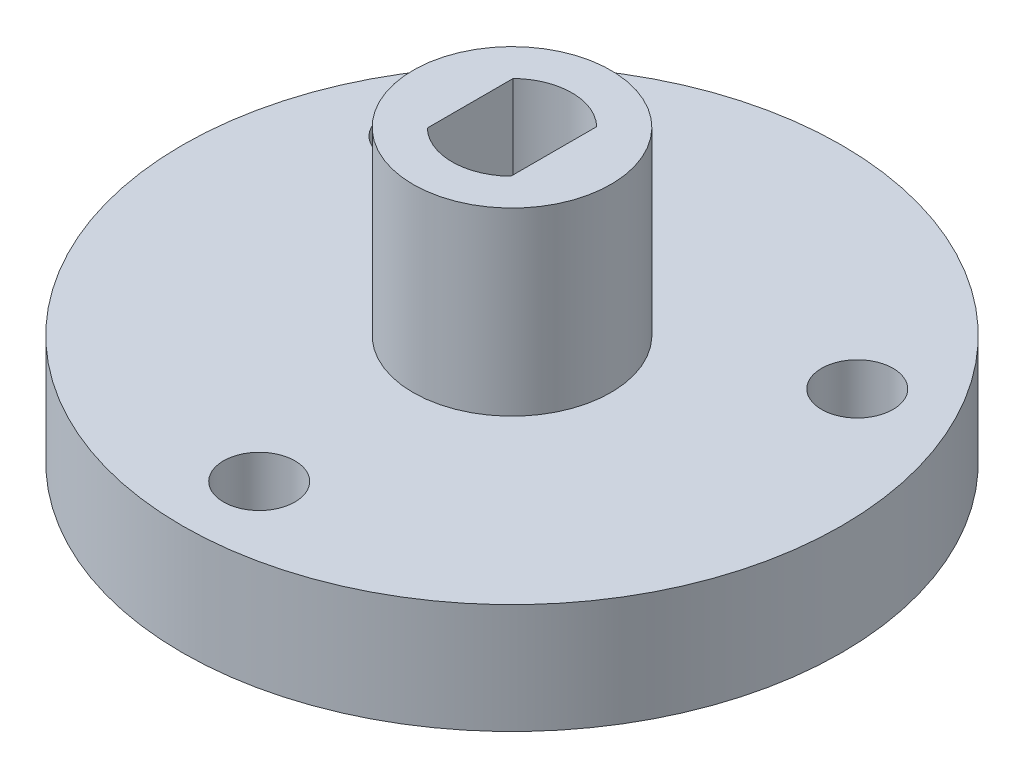
ISO-10303-21;
HEADER;
FILE_DESCRIPTION(('STEP AP214'),'2;1');
FILE_NAME('part.step','',(''),(''),'','','');
FILE_SCHEMA(('AUTOMOTIVE_DESIGN { 1 0 10303 214 1 1 1 1 }'));
ENDSEC;
DATA;
#1=APPLICATION_CONTEXT('core data for automotive mechanical design processes');
#2=APPLICATION_PROTOCOL_DEFINITION('international standard','automotive_design',2000,#1);
#3=PRODUCT_CONTEXT('',#1,'mechanical');
#4=PRODUCT('Part','Part','',(#3));
#5=PRODUCT_RELATED_PRODUCT_CATEGORY('part','',(#4));
#6=PRODUCT_DEFINITION_FORMATION('','',#4);
#7=PRODUCT_DEFINITION_CONTEXT('part definition',#1,'design');
#8=PRODUCT_DEFINITION('design','',#6,#7);
#9=PRODUCT_DEFINITION_SHAPE('','',#8);
#10=(LENGTH_UNIT() NAMED_UNIT(*) SI_UNIT(.MILLI.,.METRE.));
#11=(NAMED_UNIT(*) PLANE_ANGLE_UNIT() SI_UNIT($,.RADIAN.));
#12=(NAMED_UNIT(*) SI_UNIT($,.STERADIAN.) SOLID_ANGLE_UNIT());
#13=UNCERTAINTY_MEASURE_WITH_UNIT(LENGTH_MEASURE(1.E-05),#10,'distance_accuracy_value','');
#14=(GEOMETRIC_REPRESENTATION_CONTEXT(3) GLOBAL_UNCERTAINTY_ASSIGNED_CONTEXT((#13)) GLOBAL_UNIT_ASSIGNED_CONTEXT((#10,
#11,#12)) REPRESENTATION_CONTEXT('',''));
#15=CARTESIAN_POINT('',(0.,0.,0.));
#16=DIRECTION('',(0.,0.,1.));
#17=DIRECTION('',(1.,0.,0.));
#18=AXIS2_PLACEMENT_3D('',#15,#16,#17);
#19=CARTESIAN_POINT('',(0.,8.2,0.));
#20=DIRECTION('',(0.,1.,0.));
#21=DIRECTION('',(0.,0.,1.));
#22=AXIS2_PLACEMENT_3D('',#19,#20,#21);
#23=PLANE('',#22);
#24=CARTESIAN_POINT('',(0.,8.2,0.));
#25=DIRECTION('',(0.,1.,0.));
#26=DIRECTION('',(0.,0.,1.));
#27=AXIS2_PLACEMENT_3D('',#24,#25,#26);
#28=CIRCLE('',#27,4.5);
#29=CARTESIAN_POINT('',(0.,8.2,4.5));
#30=VERTEX_POINT('',#29);
#31=EDGE_CURVE('E129',#30,#30,#28,.T.);
#32=ORIENTED_EDGE('',*,*,#31,.T.);
#33=EDGE_LOOP('',(#32));
#34=FACE_BOUND('',#33,.T.);
#35=DIRECTION('',(0.,0.,1.));
#36=VECTOR('',#35,1.);
#37=CARTESIAN_POINT('',(-1.9,8.2,-1.95336248556176));
#38=LINE('',#37,#36);
#39=CARTESIAN_POINT('',(-1.9,8.2,-1.95336248556176));
#40=VERTEX_POINT('',#39);
#41=CARTESIAN_POINT('',(-1.9,8.2,1.95336248556176));
#42=VERTEX_POINT('',#41);
#43=EDGE_CURVE('E117',#40,#42,#38,.T.);
#44=ORIENTED_EDGE('',*,*,#43,.F.);
#45=CARTESIAN_POINT('',(0.,8.2,0.));
#46=DIRECTION('',(0.,1.,0.));
#47=DIRECTION('',(0.,0.,1.));
#48=AXIS2_PLACEMENT_3D('',#45,#46,#47);
#49=CIRCLE('',#48,2.725);
#50=CARTESIAN_POINT('',(1.9,8.2,-1.95336248556176));
#51=VERTEX_POINT('',#50);
#52=EDGE_CURVE('E90',#51,#40,#49,.T.);
#53=ORIENTED_EDGE('',*,*,#52,.F.);
#54=DIRECTION('',(0.,0.,-1.));
#55=VECTOR('',#54,1.);
#56=CARTESIAN_POINT('',(1.9,8.2,-1.95336248556176));
#57=LINE('',#56,#55);
#58=CARTESIAN_POINT('',(1.9,8.2,1.95336248556176));
#59=VERTEX_POINT('',#58);
#60=EDGE_CURVE('E70',#59,#51,#57,.T.);
#61=ORIENTED_EDGE('',*,*,#60,.F.);
#62=CARTESIAN_POINT('',(0.,8.2,0.));
#63=DIRECTION('',(0.,1.,0.));
#64=DIRECTION('',(0.,0.,1.));
#65=AXIS2_PLACEMENT_3D('',#62,#63,#64);
#66=CIRCLE('',#65,2.725);
#67=EDGE_CURVE('E236',#42,#59,#66,.T.);
#68=ORIENTED_EDGE('',*,*,#67,.F.);
#69=EDGE_LOOP('',(#44,#53,#61,#68));
#70=FACE_BOUND('',#69,.T.);
#71=ADVANCED_FACE('F47',(#34,#70),#23,.T.);
#72=CARTESIAN_POINT('',(0.,8.2,0.));
#73=DIRECTION('',(0.,-1.,0.));
#74=DIRECTION('',(0.,0.,-1.));
#75=AXIS2_PLACEMENT_3D('',#72,#73,#74);
#76=CYLINDRICAL_SURFACE('',#75,4.5);
#77=ORIENTED_EDGE('',*,*,#31,.F.);
#78=EDGE_LOOP('',(#77));
#79=FACE_BOUND('',#78,.T.);
#80=CARTESIAN_POINT('',(0.,0.,0.));
#81=DIRECTION('',(0.,1.,0.));
#82=DIRECTION('',(0.,0.,1.));
#83=AXIS2_PLACEMENT_3D('',#80,#81,#82);
#84=CIRCLE('',#83,4.5);
#85=CARTESIAN_POINT('',(0.,0.,4.5));
#86=VERTEX_POINT('',#85);
#87=EDGE_CURVE('E109',#86,#86,#84,.T.);
#88=ORIENTED_EDGE('',*,*,#87,.T.);
#89=EDGE_LOOP('',(#88));
#90=FACE_BOUND('',#89,.T.);
#91=ADVANCED_FACE('F169',(#79,#90),#76,.T.);
#92=CARTESIAN_POINT('',(0.,8.2,0.));
#93=DIRECTION('',(0.,-1.,0.));
#94=DIRECTION('',(0.,0.,-1.));
#95=AXIS2_PLACEMENT_3D('',#92,#93,#94);
#96=CYLINDRICAL_SURFACE('',#95,2.725);
#97=CARTESIAN_POINT('',(0.,0.,0.));
#98=DIRECTION('',(0.,1.,0.));
#99=DIRECTION('',(0.,0.,1.));
#100=AXIS2_PLACEMENT_3D('',#97,#98,#99);
#101=CIRCLE('',#100,2.725);
#102=CARTESIAN_POINT('',(1.9,0.,-1.95336248556176));
#103=VERTEX_POINT('',#102);
#104=CARTESIAN_POINT('',(-1.9,0.,-1.95336248556176));
#105=VERTEX_POINT('',#104);
#106=EDGE_CURVE('E102',#103,#105,#101,.T.);
#107=ORIENTED_EDGE('',*,*,#106,.F.);
#108=DIRECTION('',(0.,-1.,0.));
#109=VECTOR('',#108,1.);
#110=CARTESIAN_POINT('',(1.9,8.2,-1.95336248556176));
#111=LINE('',#110,#109);
#112=EDGE_CURVE('E93',#51,#103,#111,.T.);
#113=ORIENTED_EDGE('',*,*,#112,.F.);
#114=ORIENTED_EDGE('',*,*,#52,.T.);
#115=DIRECTION('',(0.,-1.,0.));
#116=VECTOR('',#115,1.);
#117=CARTESIAN_POINT('',(-1.9,8.2,-1.95336248556176));
#118=LINE('',#117,#116);
#119=EDGE_CURVE('E104',#40,#105,#118,.T.);
#120=ORIENTED_EDGE('',*,*,#119,.T.);
#121=EDGE_LOOP('',(#107,#113,#114,#120));
#122=FACE_BOUND('',#121,.T.);
#123=ADVANCED_FACE('F103',(#122),#96,.F.);
#124=CARTESIAN_POINT('',(-1.9,8.2,-1.95336248556176));
#125=DIRECTION('',(1.,0.,0.));
#126=DIRECTION('',(0.,0.,-1.));
#127=AXIS2_PLACEMENT_3D('',#124,#125,#126);
#128=PLANE('',#127);
#129=DIRECTION('',(0.,0.,1.));
#130=VECTOR('',#129,1.);
#131=CARTESIAN_POINT('',(-1.9,0.,-1.95336248556176));
#132=LINE('',#131,#130);
#133=CARTESIAN_POINT('',(-1.9,0.,1.95336248556176));
#134=VERTEX_POINT('',#133);
#135=EDGE_CURVE('E108',#105,#134,#132,.T.);
#136=ORIENTED_EDGE('',*,*,#135,.F.);
#137=ORIENTED_EDGE('',*,*,#119,.F.);
#138=ORIENTED_EDGE('',*,*,#43,.T.);
#139=DIRECTION('',(0.,-1.,0.));
#140=VECTOR('',#139,1.);
#141=CARTESIAN_POINT('',(-1.9,8.2,1.95336248556176));
#142=LINE('',#141,#140);
#143=EDGE_CURVE('E124',#42,#134,#142,.T.);
#144=ORIENTED_EDGE('',*,*,#143,.T.);
#145=EDGE_LOOP('',(#136,#137,#138,#144));
#146=FACE_BOUND('',#145,.T.);
#147=ADVANCED_FACE('F180',(#146),#128,.T.);
#148=CARTESIAN_POINT('',(0.,8.2,0.));
#149=DIRECTION('',(0.,-1.,0.));
#150=DIRECTION('',(0.,0.,-1.));
#151=AXIS2_PLACEMENT_3D('',#148,#149,#150);
#152=CYLINDRICAL_SURFACE('',#151,2.725);
#153=CARTESIAN_POINT('',(0.,0.,0.));
#154=DIRECTION('',(0.,1.,0.));
#155=DIRECTION('',(0.,0.,1.));
#156=AXIS2_PLACEMENT_3D('',#153,#154,#155);
#157=CIRCLE('',#156,2.725);
#158=CARTESIAN_POINT('',(1.9,0.,1.95336248556176));
#159=VERTEX_POINT('',#158);
#160=EDGE_CURVE('E112',#134,#159,#157,.T.);
#161=ORIENTED_EDGE('',*,*,#160,.F.);
#162=ORIENTED_EDGE('',*,*,#143,.F.);
#163=ORIENTED_EDGE('',*,*,#67,.T.);
#164=DIRECTION('',(0.,-1.,0.));
#165=VECTOR('',#164,1.);
#166=CARTESIAN_POINT('',(1.9,8.2,1.95336248556176));
#167=LINE('',#166,#165);
#168=EDGE_CURVE('E64',#59,#159,#167,.T.);
#169=ORIENTED_EDGE('',*,*,#168,.T.);
#170=EDGE_LOOP('',(#161,#162,#163,#169));
#171=FACE_BOUND('',#170,.T.);
#172=ADVANCED_FACE('F183',(#171),#152,.F.);
#173=CARTESIAN_POINT('',(1.9,8.2,-1.95336248556176));
#174=DIRECTION('',(-1.,0.,0.));
#175=DIRECTION('',(0.,0.,1.));
#176=AXIS2_PLACEMENT_3D('',#173,#174,#175);
#177=PLANE('',#176);
#178=DIRECTION('',(0.,0.,-1.));
#179=VECTOR('',#178,1.);
#180=CARTESIAN_POINT('',(1.9,0.,-1.95336248556176));
#181=LINE('',#180,#179);
#182=EDGE_CURVE('E97',#159,#103,#181,.T.);
#183=ORIENTED_EDGE('',*,*,#182,.F.);
#184=ORIENTED_EDGE('',*,*,#168,.F.);
#185=ORIENTED_EDGE('',*,*,#60,.T.);
#186=ORIENTED_EDGE('',*,*,#112,.T.);
#187=EDGE_LOOP('',(#183,#184,#185,#186));
#188=FACE_BOUND('',#187,.T.);
#189=ADVANCED_FACE('F95',(#188),#177,.T.);
#190=CARTESIAN_POINT('',(0.,0.,0.));
#191=DIRECTION('',(0.,-1.,0.));
#192=DIRECTION('',(0.,0.,-1.));
#193=AXIS2_PLACEMENT_3D('',#190,#191,#192);
#194=PLANE('',#193);
#195=CARTESIAN_POINT('',(0.,0.,0.));
#196=DIRECTION('',(0.,-1.,0.));
#197=DIRECTION('',(0.,0.,-1.));
#198=AXIS2_PLACEMENT_3D('',#195,#196,#197);
#199=CIRCLE('',#198,1.);
#200=CARTESIAN_POINT('',(0.,0.,-1.));
#201=VERTEX_POINT('',#200);
#202=EDGE_CURVE('E149',#201,#201,#199,.T.);
#203=ORIENTED_EDGE('',*,*,#202,.T.);
#204=EDGE_LOOP('',(#203));
#205=FACE_BOUND('',#204,.T.);
#206=ORIENTED_EDGE('',*,*,#182,.T.);
#207=ORIENTED_EDGE('',*,*,#106,.T.);
#208=ORIENTED_EDGE('',*,*,#135,.T.);
#209=ORIENTED_EDGE('',*,*,#160,.T.);
#210=EDGE_LOOP('',(#206,#207,#208,#209));
#211=FACE_BOUND('',#210,.T.);
#212=ADVANCED_FACE('F111',(#205,#211),#194,.F.);
#213=CARTESIAN_POINT('',(0.,-5.,0.));
#214=DIRECTION('',(0.,1.,0.));
#215=DIRECTION('',(0.,0.,1.));
#216=AXIS2_PLACEMENT_3D('',#213,#214,#215);
#217=CYLINDRICAL_SURFACE('',#216,15.);
#218=CARTESIAN_POINT('',(0.,-5.,0.));
#219=DIRECTION('',(0.,-1.,0.));
#220=DIRECTION('',(0.,0.,-1.));
#221=AXIS2_PLACEMENT_3D('',#218,#219,#220);
#222=CIRCLE('',#221,15.);
#223=CARTESIAN_POINT('',(0.,-5.,-15.));
#224=VERTEX_POINT('',#223);
#225=EDGE_CURVE('E136',#224,#224,#222,.T.);
#226=ORIENTED_EDGE('',*,*,#225,.F.);
#227=EDGE_LOOP('',(#226));
#228=FACE_BOUND('',#227,.T.);
#229=CARTESIAN_POINT('',(0.,0.,0.));
#230=DIRECTION('',(0.,-1.,0.));
#231=DIRECTION('',(0.,0.,-1.));
#232=AXIS2_PLACEMENT_3D('',#229,#230,#231);
#233=CIRCLE('',#232,15.);
#234=CARTESIAN_POINT('',(0.,0.,-15.));
#235=VERTEX_POINT('',#234);
#236=EDGE_CURVE('E223',#235,#235,#233,.T.);
#237=ORIENTED_EDGE('',*,*,#236,.T.);
#238=EDGE_LOOP('',(#237));
#239=FACE_BOUND('',#238,.T.);
#240=ADVANCED_FACE('F189',(#228,#239),#217,.T.);
#241=CARTESIAN_POINT('',(0.,-5.,0.));
#242=DIRECTION('',(0.,-1.,0.));
#243=DIRECTION('',(0.,0.,-1.));
#244=AXIS2_PLACEMENT_3D('',#241,#242,#243);
#245=PLANE('',#244);
#246=CARTESIAN_POINT('',(0.,-5.,0.));
#247=DIRECTION('',(0.,-1.,0.));
#248=DIRECTION('',(0.,0.,-1.));
#249=AXIS2_PLACEMENT_3D('',#246,#247,#248);
#250=CIRCLE('',#249,2.50000000000001);
#251=CARTESIAN_POINT('',(0.,-5.,-2.50000000000001));
#252=VERTEX_POINT('',#251);
#253=EDGE_CURVE('E11',#252,#252,#250,.F.);
#254=ORIENTED_EDGE('',*,*,#253,.T.);
#255=EDGE_LOOP('',(#254));
#256=FACE_BOUND('',#255,.T.);
#257=CARTESIAN_POINT('',(9.95929214352105,-5.,-5.75));
#258=DIRECTION('',(0.,-1.,0.));
#259=DIRECTION('',(0.,0.,-1.));
#260=AXIS2_PLACEMENT_3D('',#257,#258,#259);
#261=CIRCLE('',#260,1.62500000000005);
#262=CARTESIAN_POINT('',(9.95929214352105,-5.,-7.37500000000005));
#263=VERTEX_POINT('',#262);
#264=EDGE_CURVE('E142',#263,#263,#261,.T.);
#265=ORIENTED_EDGE('',*,*,#264,.F.);
#266=EDGE_LOOP('',(#265));
#267=FACE_BOUND('',#266,.T.);
#268=CARTESIAN_POINT('',(0.,-5.,11.5));
#269=DIRECTION('',(0.,-1.,0.));
#270=DIRECTION('',(0.,0.,-1.));
#271=AXIS2_PLACEMENT_3D('',#268,#269,#270);
#272=CIRCLE('',#271,1.625);
#273=CARTESIAN_POINT('',(0.,-5.,9.875));
#274=VERTEX_POINT('',#273);
#275=EDGE_CURVE('E213',#274,#274,#272,.T.);
#276=ORIENTED_EDGE('',*,*,#275,.F.);
#277=EDGE_LOOP('',(#276));
#278=FACE_BOUND('',#277,.T.);
#279=CARTESIAN_POINT('',(-9.95929214352105,-5.,-5.75));
#280=DIRECTION('',(0.,-1.,0.));
#281=DIRECTION('',(0.,0.,-1.));
#282=AXIS2_PLACEMENT_3D('',#279,#280,#281);
#283=CIRCLE('',#282,1.6250000000001);
#284=CARTESIAN_POINT('',(-9.95929214352105,-5.,-7.3750000000001));
#285=VERTEX_POINT('',#284);
#286=EDGE_CURVE('E245',#285,#285,#283,.T.);
#287=ORIENTED_EDGE('',*,*,#286,.F.);
#288=EDGE_LOOP('',(#287));
#289=FACE_BOUND('',#288,.T.);
#290=ORIENTED_EDGE('',*,*,#225,.T.);
#291=EDGE_LOOP('',(#290));
#292=FACE_BOUND('',#291,.T.);
#293=ADVANCED_FACE('F192',(#256,#267,#278,#289,#292),#245,.T.);
#294=CARTESIAN_POINT('',(9.95929214352105,0.,-5.75));
#295=DIRECTION('',(0.,-1.,0.));
#296=DIRECTION('',(0.,0.,-1.));
#297=AXIS2_PLACEMENT_3D('',#294,#295,#296);
#298=CIRCLE('',#297,1.62500000000005);
#299=CARTESIAN_POINT('',(9.95929214352105,0.,-7.37500000000005));
#300=VERTEX_POINT('',#299);
#301=EDGE_CURVE('E146',#300,#300,#298,.T.);
#302=ORIENTED_EDGE('',*,*,#301,.T.);
#303=EDGE_LOOP('',(#302));
#304=FACE_BOUND('',#303,.T.);
#305=CARTESIAN_POINT('',(0.,0.,11.5));
#306=DIRECTION('',(0.,-1.,0.));
#307=DIRECTION('',(0.,0.,-1.));
#308=AXIS2_PLACEMENT_3D('',#305,#306,#307);
#309=CIRCLE('',#308,1.625);
#310=CARTESIAN_POINT('',(0.,0.,9.875));
#311=VERTEX_POINT('',#310);
#312=EDGE_CURVE('E141',#311,#311,#309,.T.);
#313=ORIENTED_EDGE('',*,*,#312,.T.);
#314=EDGE_LOOP('',(#313));
#315=FACE_BOUND('',#314,.T.);
#316=CARTESIAN_POINT('',(-9.95929214352105,0.,-5.75));
#317=DIRECTION('',(0.,-1.,0.));
#318=DIRECTION('',(0.,0.,-1.));
#319=AXIS2_PLACEMENT_3D('',#316,#317,#318);
#320=CIRCLE('',#319,1.6250000000001);
#321=CARTESIAN_POINT('',(-9.95929214352105,0.,-7.3750000000001));
#322=VERTEX_POINT('',#321);
#323=EDGE_CURVE('E137',#322,#322,#320,.T.);
#324=ORIENTED_EDGE('',*,*,#323,.T.);
#325=EDGE_LOOP('',(#324));
#326=FACE_BOUND('',#325,.T.);
#327=ORIENTED_EDGE('',*,*,#87,.F.);
#328=EDGE_LOOP('',(#327));
#329=FACE_BOUND('',#328,.T.);
#330=ORIENTED_EDGE('',*,*,#236,.F.);
#331=EDGE_LOOP('',(#330));
#332=FACE_BOUND('',#331,.T.);
#333=ADVANCED_FACE('F194',(#304,#315,#326,#329,#332),#194,.F.);
#334=CARTESIAN_POINT('',(0.,8.2,0.));
#335=DIRECTION('',(0.,-1.,0.));
#336=DIRECTION('',(0.,0.,-1.));
#337=AXIS2_PLACEMENT_3D('',#334,#335,#336);
#338=CYLINDRICAL_SURFACE('',#337,1.);
#339=CARTESIAN_POINT('',(0.,-4.13397459621555,0.));
#340=DIRECTION('',(0.,-1.,0.));
#341=DIRECTION('',(0.,0.,-1.));
#342=AXIS2_PLACEMENT_3D('',#339,#340,#341);
#343=CIRCLE('',#342,1.);
#344=CARTESIAN_POINT('',(0.,-4.13397459621555,-1.));
#345=VERTEX_POINT('',#344);
#346=EDGE_CURVE('E57',#345,#345,#343,.T.);
#347=ORIENTED_EDGE('',*,*,#346,.T.);
#348=EDGE_LOOP('',(#347));
#349=FACE_BOUND('',#348,.T.);
#350=ORIENTED_EDGE('',*,*,#202,.F.);
#351=EDGE_LOOP('',(#350));
#352=FACE_BOUND('',#351,.T.);
#353=ADVANCED_FACE('F154',(#349,#352),#338,.F.);
#354=CARTESIAN_POINT('',(-9.95929214352105,8.2,-5.75));
#355=DIRECTION('',(0.,-1.,0.));
#356=DIRECTION('',(0.,0.,-1.));
#357=AXIS2_PLACEMENT_3D('',#354,#355,#356);
#358=CYLINDRICAL_SURFACE('',#357,1.6250000000001);
#359=ORIENTED_EDGE('',*,*,#286,.T.);
#360=EDGE_LOOP('',(#359));
#361=FACE_BOUND('',#360,.T.);
#362=ORIENTED_EDGE('',*,*,#323,.F.);
#363=EDGE_LOOP('',(#362));
#364=FACE_BOUND('',#363,.T.);
#365=ADVANCED_FACE('F202',(#361,#364),#358,.F.);
#366=CARTESIAN_POINT('',(0.,8.2,11.5));
#367=DIRECTION('',(0.,-1.,0.));
#368=DIRECTION('',(0.,0.,-1.));
#369=AXIS2_PLACEMENT_3D('',#366,#367,#368);
#370=CYLINDRICAL_SURFACE('',#369,1.625);
#371=ORIENTED_EDGE('',*,*,#275,.T.);
#372=EDGE_LOOP('',(#371));
#373=FACE_BOUND('',#372,.T.);
#374=ORIENTED_EDGE('',*,*,#312,.F.);
#375=EDGE_LOOP('',(#374));
#376=FACE_BOUND('',#375,.T.);
#377=ADVANCED_FACE('F164',(#373,#376),#370,.F.);
#378=CARTESIAN_POINT('',(9.95929214352105,8.2,-5.75));
#379=DIRECTION('',(0.,-1.,0.));
#380=DIRECTION('',(0.,0.,-1.));
#381=AXIS2_PLACEMENT_3D('',#378,#379,#380);
#382=CYLINDRICAL_SURFACE('',#381,1.62500000000005);
#383=ORIENTED_EDGE('',*,*,#264,.T.);
#384=EDGE_LOOP('',(#383));
#385=FACE_BOUND('',#384,.T.);
#386=ORIENTED_EDGE('',*,*,#301,.F.);
#387=EDGE_LOOP('',(#386));
#388=FACE_BOUND('',#387,.T.);
#389=ADVANCED_FACE('F158',(#385,#388),#382,.F.);
#390=CARTESIAN_POINT('',(0.,-4.13397459621555,0.));
#391=DIRECTION('',(0.,-1.,0.));
#392=DIRECTION('',(0.,0.,-1.));
#393=AXIS2_PLACEMENT_3D('',#390,#391,#392);
#394=CONICAL_SURFACE('',#393,1.,1.0471975511966);
#395=ORIENTED_EDGE('',*,*,#253,.F.);
#396=EDGE_LOOP('',(#395));
#397=FACE_BOUND('',#396,.T.);
#398=ORIENTED_EDGE('',*,*,#346,.F.);
#399=EDGE_LOOP('',(#398));
#400=FACE_BOUND('',#399,.T.);
#401=ADVANCED_FACE('F50',(#397,#400),#394,.F.);
#402=CLOSED_SHELL('',(#71,#91,#123,#147,#172,#189,#212,#240,#293,#333,#353,#365,#377,#389,#401));
#403=MANIFOLD_SOLID_BREP('B2',#402);
#404=ADVANCED_BREP_SHAPE_REPRESENTATION('',(#18,#403),#14);
#405=SHAPE_DEFINITION_REPRESENTATION(#9,#404);
ENDSEC;
END-ISO-10303-21;
